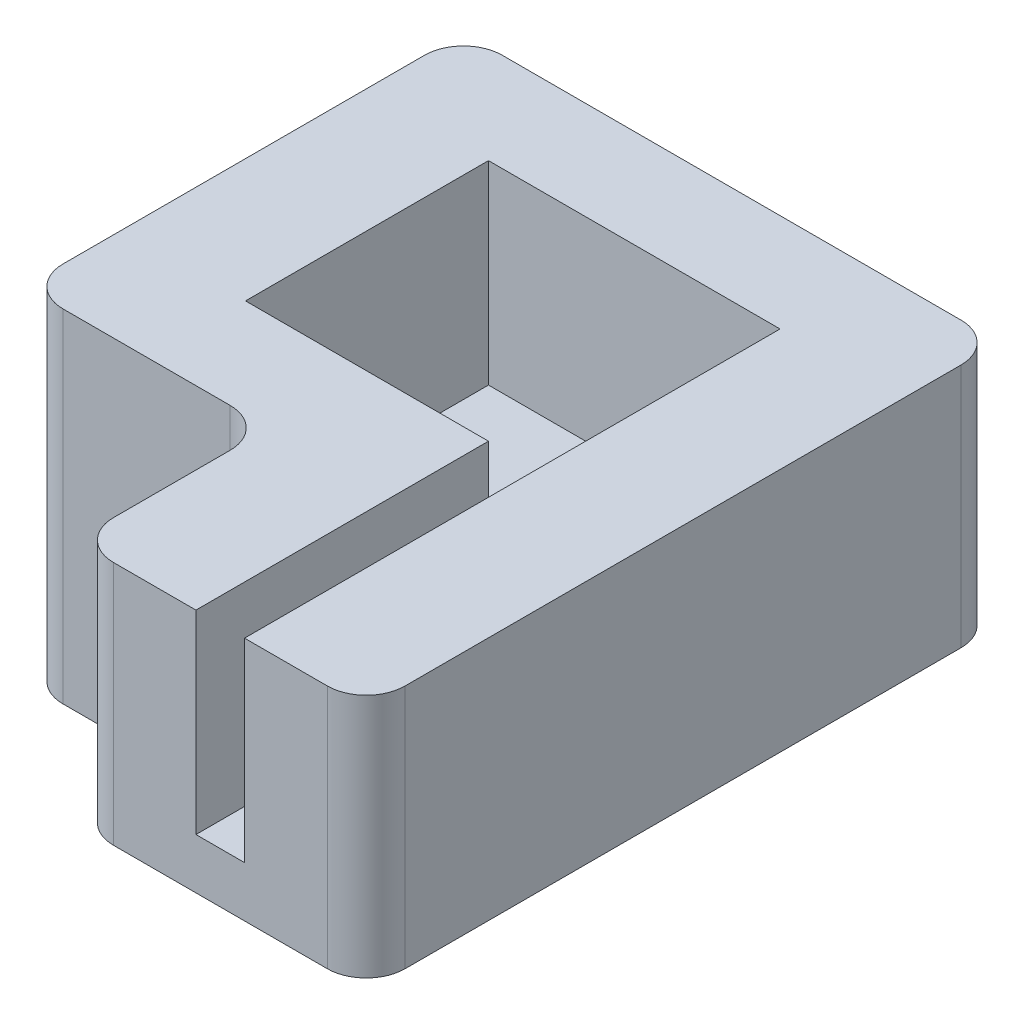
ISO-10303-21;
HEADER;
FILE_DESCRIPTION(('STEP AP214'),'2;1');
FILE_NAME('part.step','',(''),(''),'','','');
FILE_SCHEMA(('AUTOMOTIVE_DESIGN { 1 0 10303 214 1 1 1 1 }'));
ENDSEC;
DATA;
#1=APPLICATION_CONTEXT('core data for automotive mechanical design processes');
#2=APPLICATION_PROTOCOL_DEFINITION('international standard','automotive_design',2000,#1);
#3=PRODUCT_CONTEXT('',#1,'mechanical');
#4=PRODUCT('Part','Part','',(#3));
#5=PRODUCT_RELATED_PRODUCT_CATEGORY('part','',(#4));
#6=PRODUCT_DEFINITION_FORMATION('','',#4);
#7=PRODUCT_DEFINITION_CONTEXT('part definition',#1,'design');
#8=PRODUCT_DEFINITION('design','',#6,#7);
#9=PRODUCT_DEFINITION_SHAPE('','',#8);
#10=(LENGTH_UNIT() NAMED_UNIT(*) SI_UNIT(.MILLI.,.METRE.));
#11=(NAMED_UNIT(*) PLANE_ANGLE_UNIT() SI_UNIT($,.RADIAN.));
#12=(NAMED_UNIT(*) SI_UNIT($,.STERADIAN.) SOLID_ANGLE_UNIT());
#13=UNCERTAINTY_MEASURE_WITH_UNIT(LENGTH_MEASURE(1.E-05),#10,'distance_accuracy_value','');
#14=(GEOMETRIC_REPRESENTATION_CONTEXT(3) GLOBAL_UNCERTAINTY_ASSIGNED_CONTEXT((#13)) GLOBAL_UNIT_ASSIGNED_CONTEXT((#10,
#11,#12)) REPRESENTATION_CONTEXT('',''));
#15=CARTESIAN_POINT('',(0.,0.,0.));
#16=DIRECTION('',(0.,0.,1.));
#17=DIRECTION('',(1.,0.,0.));
#18=AXIS2_PLACEMENT_3D('',#15,#16,#17);
#19=CARTESIAN_POINT('',(-17.526,22.352,14.351));
#20=DIRECTION('',(0.,0.,-1.));
#21=DIRECTION('',(-1.,0.,0.));
#22=AXIS2_PLACEMENT_3D('',#19,#20,#21);
#23=PLANE('',#22);
#24=DIRECTION('',(1.,0.,0.));
#25=VECTOR('',#24,1.);
#26=CARTESIAN_POINT('',(-17.526,0.,14.351));
#27=LINE('',#26,#25);
#28=CARTESIAN_POINT('',(-14.986,0.,14.351));
#29=VERTEX_POINT('',#28);
#30=CARTESIAN_POINT('',(8.636,0.,14.351));
#31=VERTEX_POINT('',#30);
#32=EDGE_CURVE('E267',#29,#31,#27,.T.);
#33=ORIENTED_EDGE('',*,*,#32,.T.);
#34=DIRECTION('',(0.,-1.,0.));
#35=VECTOR('',#34,1.);
#36=CARTESIAN_POINT('',(8.636,22.352,14.351));
#37=LINE('',#36,#35);
#38=CARTESIAN_POINT('',(8.63600000000001,6.35,14.351));
#39=VERTEX_POINT('',#38);
#40=EDGE_CURVE('E351',#31,#39,#37,.F.);
#41=ORIENTED_EDGE('',*,*,#40,.T.);
#42=DIRECTION('',(1.,0.,0.));
#43=VECTOR('',#42,1.);
#44=CARTESIAN_POINT('',(17.526,6.35,14.351));
#45=LINE('',#44,#43);
#46=CARTESIAN_POINT('',(-4.06399999999999,6.35,14.351));
#47=VERTEX_POINT('',#46);
#48=EDGE_CURVE('E230',#47,#39,#45,.T.);
#49=ORIENTED_EDGE('',*,*,#48,.F.);
#50=DIRECTION('',(0.,-1.,0.));
#51=VECTOR('',#50,1.);
#52=CARTESIAN_POINT('',(-4.064,22.352,14.351));
#53=LINE('',#52,#51);
#54=CARTESIAN_POINT('',(-4.064,22.352,14.351));
#55=VERTEX_POINT('',#54);
#56=EDGE_CURVE('E315',#47,#55,#53,.F.);
#57=ORIENTED_EDGE('',*,*,#56,.T.);
#58=DIRECTION('',(1.,0.,0.));
#59=VECTOR('',#58,1.);
#60=CARTESIAN_POINT('',(-17.526,22.352,14.351));
#61=LINE('',#60,#59);
#62=CARTESIAN_POINT('',(-14.986,22.352,14.351));
#63=VERTEX_POINT('',#62);
#64=EDGE_CURVE('E273',#63,#55,#61,.T.);
#65=ORIENTED_EDGE('',*,*,#64,.F.);
#66=DIRECTION('',(0.,-1.,0.));
#67=VECTOR('',#66,1.);
#68=CARTESIAN_POINT('',(-14.986,22.352,14.351));
#69=LINE('',#68,#67);
#70=EDGE_CURVE('E317',#63,#29,#69,.T.);
#71=ORIENTED_EDGE('',*,*,#70,.T.);
#72=EDGE_LOOP('',(#33,#41,#49,#57,#65,#71));
#73=FACE_BOUND('',#72,.T.);
#74=ADVANCED_FACE('F36',(#73),#23,.F.);
#75=CARTESIAN_POINT('',(17.526,22.352,-14.351));
#76=DIRECTION('',(-1.,0.,0.));
#77=DIRECTION('',(0.,0.,1.));
#78=AXIS2_PLACEMENT_3D('',#75,#76,#77);
#79=PLANE('',#78);
#80=DIRECTION('',(0.,0.,-1.));
#81=VECTOR('',#80,1.);
#82=CARTESIAN_POINT('',(17.526,22.352,-14.351));
#83=LINE('',#82,#81);
#84=CARTESIAN_POINT('',(17.526,22.352,24.511));
#85=VERTEX_POINT('',#84);
#86=CARTESIAN_POINT('',(17.526,22.352,-11.811));
#87=VERTEX_POINT('',#86);
#88=EDGE_CURVE('E264',#85,#87,#83,.T.);
#89=ORIENTED_EDGE('',*,*,#88,.F.);
#90=DIRECTION('',(0.,1.,0.));
#91=VECTOR('',#90,1.);
#92=CARTESIAN_POINT('',(17.526,6.35,24.511));
#93=LINE('',#92,#91);
#94=CARTESIAN_POINT('',(17.526,6.35,24.511));
#95=VERTEX_POINT('',#94);
#96=EDGE_CURVE('E44',#85,#95,#93,.F.);
#97=ORIENTED_EDGE('',*,*,#96,.T.);
#98=DIRECTION('',(0.,0.,1.));
#99=VECTOR('',#98,1.);
#100=CARTESIAN_POINT('',(17.526,6.35000000000001,-14.351));
#101=LINE('',#100,#99);
#102=CARTESIAN_POINT('',(17.526,6.35000000000001,-11.811));
#103=VERTEX_POINT('',#102);
#104=EDGE_CURVE('E252',#103,#95,#101,.T.);
#105=ORIENTED_EDGE('',*,*,#104,.F.);
#106=DIRECTION('',(0.,-1.,0.));
#107=VECTOR('',#106,1.);
#108=CARTESIAN_POINT('',(17.526,22.352,-11.811));
#109=LINE('',#108,#107);
#110=EDGE_CURVE('E291',#103,#87,#109,.F.);
#111=ORIENTED_EDGE('',*,*,#110,.T.);
#112=EDGE_LOOP('',(#89,#97,#105,#111));
#113=FACE_BOUND('',#112,.T.);
#114=ADVANCED_FACE('F356',(#113),#79,.F.);
#115=CARTESIAN_POINT('',(-17.526,22.352,-14.351));
#116=DIRECTION('',(0.,0.,1.));
#117=DIRECTION('',(1.,0.,0.));
#118=AXIS2_PLACEMENT_3D('',#115,#116,#117);
#119=PLANE('',#118);
#120=DIRECTION('',(-1.,0.,0.));
#121=VECTOR('',#120,1.);
#122=CARTESIAN_POINT('',(-17.526,22.352,-14.351));
#123=LINE('',#122,#121);
#124=CARTESIAN_POINT('',(14.986,22.352,-14.351));
#125=VERTEX_POINT('',#124);
#126=CARTESIAN_POINT('',(-14.986,22.352,-14.351));
#127=VERTEX_POINT('',#126);
#128=EDGE_CURVE('E266',#125,#127,#123,.T.);
#129=ORIENTED_EDGE('',*,*,#128,.F.);
#130=DIRECTION('',(0.,-1.,0.));
#131=VECTOR('',#130,1.);
#132=CARTESIAN_POINT('',(14.986,22.352,-14.351));
#133=LINE('',#132,#131);
#134=CARTESIAN_POINT('',(14.986,6.35000000000001,-14.351));
#135=VERTEX_POINT('',#134);
#136=EDGE_CURVE('E286',#125,#135,#133,.T.);
#137=ORIENTED_EDGE('',*,*,#136,.T.);
#138=DIRECTION('',(1.,0.,0.));
#139=VECTOR('',#138,1.);
#140=CARTESIAN_POINT('',(11.176,6.35000000000001,-14.351));
#141=LINE('',#140,#139);
#142=CARTESIAN_POINT('',(8.636,6.35000000000001,-14.351));
#143=VERTEX_POINT('',#142);
#144=EDGE_CURVE('E258',#143,#135,#141,.T.);
#145=ORIENTED_EDGE('',*,*,#144,.F.);
#146=DIRECTION('',(0.,1.,0.));
#147=VECTOR('',#146,1.);
#148=CARTESIAN_POINT('',(8.636,22.352,-14.351));
#149=LINE('',#148,#147);
#150=CARTESIAN_POINT('',(8.636,0.,-14.351));
#151=VERTEX_POINT('',#150);
#152=EDGE_CURVE('E284',#143,#151,#149,.F.);
#153=ORIENTED_EDGE('',*,*,#152,.T.);
#154=DIRECTION('',(-1.,0.,0.));
#155=VECTOR('',#154,1.);
#156=CARTESIAN_POINT('',(-17.526,0.,-14.351));
#157=LINE('',#156,#155);
#158=CARTESIAN_POINT('',(-14.986,0.,-14.351));
#159=VERTEX_POINT('',#158);
#160=EDGE_CURVE('E263',#151,#159,#157,.T.);
#161=ORIENTED_EDGE('',*,*,#160,.T.);
#162=DIRECTION('',(0.,-1.,0.));
#163=VECTOR('',#162,1.);
#164=CARTESIAN_POINT('',(-14.986,22.352,-14.351));
#165=LINE('',#164,#163);
#166=EDGE_CURVE('E276',#159,#127,#165,.F.);
#167=ORIENTED_EDGE('',*,*,#166,.T.);
#168=EDGE_LOOP('',(#129,#137,#145,#153,#161,#167));
#169=FACE_BOUND('',#168,.T.);
#170=ADVANCED_FACE('F412',(#169),#119,.F.);
#171=CARTESIAN_POINT('',(-17.526,22.352,-14.351));
#172=DIRECTION('',(1.,0.,0.));
#173=DIRECTION('',(0.,0.,-1.));
#174=AXIS2_PLACEMENT_3D('',#171,#172,#173);
#175=PLANE('',#174);
#176=DIRECTION('',(0.,0.,1.));
#177=VECTOR('',#176,1.);
#178=CARTESIAN_POINT('',(-17.526,22.352,-14.351));
#179=LINE('',#178,#177);
#180=CARTESIAN_POINT('',(-17.526,22.352,-11.811));
#181=VERTEX_POINT('',#180);
#182=CARTESIAN_POINT('',(-17.526,22.352,11.811));
#183=VERTEX_POINT('',#182);
#184=EDGE_CURVE('E270',#181,#183,#179,.T.);
#185=ORIENTED_EDGE('',*,*,#184,.F.);
#186=DIRECTION('',(0.,-1.,0.));
#187=VECTOR('',#186,1.);
#188=CARTESIAN_POINT('',(-17.526,22.352,-11.811));
#189=LINE('',#188,#187);
#190=CARTESIAN_POINT('',(-17.526,0.,-11.811));
#191=VERTEX_POINT('',#190);
#192=EDGE_CURVE('E312',#181,#191,#189,.T.);
#193=ORIENTED_EDGE('',*,*,#192,.T.);
#194=DIRECTION('',(0.,0.,1.));
#195=VECTOR('',#194,1.);
#196=CARTESIAN_POINT('',(-17.526,0.,-14.351));
#197=LINE('',#196,#195);
#198=CARTESIAN_POINT('',(-17.526,0.,11.811));
#199=VERTEX_POINT('',#198);
#200=EDGE_CURVE('E279',#191,#199,#197,.T.);
#201=ORIENTED_EDGE('',*,*,#200,.T.);
#202=DIRECTION('',(0.,-1.,0.));
#203=VECTOR('',#202,1.);
#204=CARTESIAN_POINT('',(-17.526,22.352,11.811));
#205=LINE('',#204,#203);
#206=EDGE_CURVE('E310',#199,#183,#205,.F.);
#207=ORIENTED_EDGE('',*,*,#206,.T.);
#208=EDGE_LOOP('',(#185,#193,#201,#207));
#209=FACE_BOUND('',#208,.T.);
#210=ADVANCED_FACE('F425',(#209),#175,.F.);
#211=CARTESIAN_POINT('',(0.,22.352,0.));
#212=DIRECTION('',(0.,1.,0.));
#213=DIRECTION('',(0.,0.,1.));
#214=AXIS2_PLACEMENT_3D('',#211,#212,#213);
#215=PLANE('',#214);
#216=DIRECTION('',(0.,0.,-1.));
#217=VECTOR('',#216,1.);
#218=CARTESIAN_POINT('',(-1.524,22.352,27.051));
#219=LINE('',#218,#217);
#220=CARTESIAN_POINT('',(-1.524,22.352,24.511));
#221=VERTEX_POINT('',#220);
#222=CARTESIAN_POINT('',(-1.524,22.352,16.891));
#223=VERTEX_POINT('',#222);
#224=EDGE_CURVE('E250',#221,#223,#219,.T.);
#225=ORIENTED_EDGE('',*,*,#224,.F.);
#226=CARTESIAN_POINT('',(1.016,22.352,24.511));
#227=DIRECTION('',(0.,1.,0.));
#228=DIRECTION('',(0.,0.,1.));
#229=AXIS2_PLACEMENT_3D('',#226,#227,#228);
#230=CIRCLE('',#229,2.54);
#231=CARTESIAN_POINT('',(1.016,22.352,27.051));
#232=VERTEX_POINT('',#231);
#233=EDGE_CURVE('E346',#221,#232,#230,.T.);
#234=ORIENTED_EDGE('',*,*,#233,.T.);
#235=DIRECTION('',(-1.,0.,0.));
#236=VECTOR('',#235,1.);
#237=CARTESIAN_POINT('',(17.526,22.352,27.051));
#238=LINE('',#237,#236);
#239=CARTESIAN_POINT('',(6.40080000000001,22.352,27.051));
#240=VERTEX_POINT('',#239);
#241=EDGE_CURVE('E243',#240,#232,#238,.T.);
#242=ORIENTED_EDGE('',*,*,#241,.F.);
#243=DIRECTION('',(0.,0.,1.));
#244=VECTOR('',#243,1.);
#245=CARTESIAN_POINT('',(6.40080000000001,22.352,7.9375));
#246=LINE('',#245,#244);
#247=CARTESIAN_POINT('',(6.40080000000001,22.352,7.9375));
#248=VERTEX_POINT('',#247);
#249=EDGE_CURVE('E212',#248,#240,#246,.T.);
#250=ORIENTED_EDGE('',*,*,#249,.F.);
#251=DIRECTION('',(1.,0.,0.));
#252=VECTOR('',#251,1.);
#253=CARTESIAN_POINT('',(-9.47419999999999,22.352,7.9375));
#254=LINE('',#253,#252);
#255=CARTESIAN_POINT('',(-9.47419999999999,22.352,7.9375));
#256=VERTEX_POINT('',#255);
#257=EDGE_CURVE('E224',#256,#248,#254,.T.);
#258=ORIENTED_EDGE('',*,*,#257,.F.);
#259=DIRECTION('',(0.,0.,1.));
#260=VECTOR('',#259,1.);
#261=CARTESIAN_POINT('',(-9.47419999999999,22.352,-7.93750000000001));
#262=LINE('',#261,#260);
#263=CARTESIAN_POINT('',(-9.47419999999999,22.352,-7.93750000000001));
#264=VERTEX_POINT('',#263);
#265=EDGE_CURVE('E222',#264,#256,#262,.T.);
#266=ORIENTED_EDGE('',*,*,#265,.F.);
#267=DIRECTION('',(-1.,0.,0.));
#268=VECTOR('',#267,1.);
#269=CARTESIAN_POINT('',(9.57580000000001,22.352,-7.93750000000001));
#270=LINE('',#269,#268);
#271=CARTESIAN_POINT('',(9.57580000000001,22.352,-7.93750000000001));
#272=VERTEX_POINT('',#271);
#273=EDGE_CURVE('E192',#272,#264,#270,.T.);
#274=ORIENTED_EDGE('',*,*,#273,.F.);
#275=DIRECTION('',(0.,0.,-1.));
#276=VECTOR('',#275,1.);
#277=CARTESIAN_POINT('',(9.57580000000001,22.352,27.051));
#278=LINE('',#277,#276);
#279=CARTESIAN_POINT('',(9.57580000000001,22.352,27.051));
#280=VERTEX_POINT('',#279);
#281=EDGE_CURVE('E209',#280,#272,#278,.T.);
#282=ORIENTED_EDGE('',*,*,#281,.F.);
#283=CARTESIAN_POINT('',(14.986,22.352,27.051));
#284=VERTEX_POINT('',#283);
#285=EDGE_CURVE('E240',#284,#280,#238,.T.);
#286=ORIENTED_EDGE('',*,*,#285,.F.);
#287=CARTESIAN_POINT('',(14.986,22.352,24.511));
#288=DIRECTION('',(0.,1.,0.));
#289=DIRECTION('',(0.,0.,1.));
#290=AXIS2_PLACEMENT_3D('',#287,#288,#289);
#291=CIRCLE('',#290,2.54);
#292=EDGE_CURVE('E344',#284,#85,#291,.T.);
#293=ORIENTED_EDGE('',*,*,#292,.T.);
#294=ORIENTED_EDGE('',*,*,#88,.T.);
#295=CARTESIAN_POINT('',(14.986,22.352,-11.811));
#296=DIRECTION('',(0.,1.,0.));
#297=DIRECTION('',(0.,0.,1.));
#298=AXIS2_PLACEMENT_3D('',#295,#296,#297);
#299=CIRCLE('',#298,2.54);
#300=EDGE_CURVE('E298',#87,#125,#299,.T.);
#301=ORIENTED_EDGE('',*,*,#300,.T.);
#302=ORIENTED_EDGE('',*,*,#128,.T.);
#303=CARTESIAN_POINT('',(-14.986,22.352,-11.811));
#304=DIRECTION('',(0.,1.,0.));
#305=DIRECTION('',(0.,0.,1.));
#306=AXIS2_PLACEMENT_3D('',#303,#304,#305);
#307=CIRCLE('',#306,2.54);
#308=EDGE_CURVE('E296',#127,#181,#307,.T.);
#309=ORIENTED_EDGE('',*,*,#308,.T.);
#310=ORIENTED_EDGE('',*,*,#184,.T.);
#311=CARTESIAN_POINT('',(-14.986,22.352,11.811));
#312=DIRECTION('',(0.,1.,0.));
#313=DIRECTION('',(0.,0.,1.));
#314=AXIS2_PLACEMENT_3D('',#311,#312,#313);
#315=CIRCLE('',#314,2.54);
#316=EDGE_CURVE('E294',#183,#63,#315,.T.);
#317=ORIENTED_EDGE('',*,*,#316,.T.);
#318=ORIENTED_EDGE('',*,*,#64,.T.);
#319=CARTESIAN_POINT('',(-4.064,22.352,16.891));
#320=DIRECTION('',(0.,1.,0.));
#321=DIRECTION('',(0.,0.,1.));
#322=AXIS2_PLACEMENT_3D('',#319,#320,#321);
#323=CIRCLE('',#322,2.54);
#324=EDGE_CURVE('E329',#55,#223,#323,.F.);
#325=ORIENTED_EDGE('',*,*,#324,.T.);
#326=EDGE_LOOP('',(#225,#234,#242,#250,#258,#266,#274,#282,#286,#293,#294,#301,#302,#309,#310,
#317,#318,#325));
#327=FACE_BOUND('',#326,.T.);
#328=ADVANCED_FACE('F372',(#327),#215,.T.);
#329=CARTESIAN_POINT('',(0.,0.,0.));
#330=DIRECTION('',(0.,1.,0.));
#331=DIRECTION('',(0.,0.,1.));
#332=AXIS2_PLACEMENT_3D('',#329,#330,#331);
#333=PLANE('',#332);
#334=DIRECTION('',(0.,0.,-1.));
#335=VECTOR('',#334,1.);
#336=CARTESIAN_POINT('',(11.176,0.,-14.351));
#337=LINE('',#336,#335);
#338=CARTESIAN_POINT('',(11.176,0.,11.811));
#339=VERTEX_POINT('',#338);
#340=CARTESIAN_POINT('',(11.176,0.,-11.811));
#341=VERTEX_POINT('',#340);
#342=EDGE_CURVE('E253',#339,#341,#337,.T.);
#343=ORIENTED_EDGE('',*,*,#342,.F.);
#344=CARTESIAN_POINT('',(8.63600000000001,0.,11.811));
#345=DIRECTION('',(0.,1.,0.));
#346=DIRECTION('',(0.,0.,1.));
#347=AXIS2_PLACEMENT_3D('',#344,#345,#346);
#348=CIRCLE('',#347,2.54);
#349=EDGE_CURVE('E51',#339,#31,#348,.F.);
#350=ORIENTED_EDGE('',*,*,#349,.T.);
#351=ORIENTED_EDGE('',*,*,#32,.F.);
#352=CARTESIAN_POINT('',(-14.986,0.,11.811));
#353=DIRECTION('',(0.,1.,0.));
#354=DIRECTION('',(0.,0.,1.));
#355=AXIS2_PLACEMENT_3D('',#352,#353,#354);
#356=CIRCLE('',#355,2.54);
#357=EDGE_CURVE('E303',#29,#199,#356,.F.);
#358=ORIENTED_EDGE('',*,*,#357,.T.);
#359=ORIENTED_EDGE('',*,*,#200,.F.);
#360=CARTESIAN_POINT('',(-14.986,0.,-11.811));
#361=DIRECTION('',(0.,1.,0.));
#362=DIRECTION('',(0.,0.,1.));
#363=AXIS2_PLACEMENT_3D('',#360,#361,#362);
#364=CIRCLE('',#363,2.54);
#365=EDGE_CURVE('E305',#191,#159,#364,.F.);
#366=ORIENTED_EDGE('',*,*,#365,.T.);
#367=ORIENTED_EDGE('',*,*,#160,.F.);
#368=CARTESIAN_POINT('',(8.636,0.,-11.811));
#369=DIRECTION('',(0.,1.,0.));
#370=DIRECTION('',(0.,0.,1.));
#371=AXIS2_PLACEMENT_3D('',#368,#369,#370);
#372=CIRCLE('',#371,2.54);
#373=EDGE_CURVE('E307',#151,#341,#372,.F.);
#374=ORIENTED_EDGE('',*,*,#373,.T.);
#375=EDGE_LOOP('',(#343,#350,#351,#358,#359,#366,#367,#374));
#376=FACE_BOUND('',#375,.T.);
#377=ADVANCED_FACE('F403',(#376),#333,.F.);
#378=CARTESIAN_POINT('',(11.176,6.35000000000001,-14.351));
#379=DIRECTION('',(0.,1.,0.));
#380=DIRECTION('',(0.,0.,1.));
#381=AXIS2_PLACEMENT_3D('',#378,#379,#380);
#382=PLANE('',#381);
#383=DIRECTION('',(1.,0.,0.));
#384=VECTOR('',#383,1.);
#385=CARTESIAN_POINT('',(17.526,6.35,27.051));
#386=LINE('',#385,#384);
#387=CARTESIAN_POINT('',(1.01600000000001,6.35,27.051));
#388=VERTEX_POINT('',#387);
#389=CARTESIAN_POINT('',(14.986,6.35,27.051));
#390=VERTEX_POINT('',#389);
#391=EDGE_CURVE('E242',#388,#390,#386,.T.);
#392=ORIENTED_EDGE('',*,*,#391,.F.);
#393=CARTESIAN_POINT('',(1.01600000000001,6.35,24.511));
#394=DIRECTION('',(0.,1.,0.));
#395=DIRECTION('',(0.,0.,1.));
#396=AXIS2_PLACEMENT_3D('',#393,#394,#395);
#397=CIRCLE('',#396,2.54);
#398=CARTESIAN_POINT('',(-1.52399999999999,6.35,24.511));
#399=VERTEX_POINT('',#398);
#400=EDGE_CURVE('E340',#388,#399,#397,.F.);
#401=ORIENTED_EDGE('',*,*,#400,.T.);
#402=DIRECTION('',(0.,0.,-1.));
#403=VECTOR('',#402,1.);
#404=CARTESIAN_POINT('',(-1.52399999999999,6.35,27.051));
#405=LINE('',#404,#403);
#406=CARTESIAN_POINT('',(-1.52399999999999,6.35,16.891));
#407=VERTEX_POINT('',#406);
#408=EDGE_CURVE('E246',#399,#407,#405,.T.);
#409=ORIENTED_EDGE('',*,*,#408,.T.);
#410=CARTESIAN_POINT('',(-4.06399999999999,6.35,16.891));
#411=DIRECTION('',(0.,1.,0.));
#412=DIRECTION('',(0.,0.,1.));
#413=AXIS2_PLACEMENT_3D('',#410,#411,#412);
#414=CIRCLE('',#413,2.54);
#415=EDGE_CURVE('E326',#407,#47,#414,.T.);
#416=ORIENTED_EDGE('',*,*,#415,.T.);
#417=ORIENTED_EDGE('',*,*,#48,.T.);
#418=CARTESIAN_POINT('',(8.63600000000001,6.35,11.811));
#419=DIRECTION('',(0.,1.,0.));
#420=DIRECTION('',(0.,0.,1.));
#421=AXIS2_PLACEMENT_3D('',#418,#419,#420);
#422=CIRCLE('',#421,2.54);
#423=CARTESIAN_POINT('',(11.176,6.35,11.811));
#424=VERTEX_POINT('',#423);
#425=EDGE_CURVE('E11',#39,#424,#422,.T.);
#426=ORIENTED_EDGE('',*,*,#425,.T.);
#427=DIRECTION('',(0.,0.,1.));
#428=VECTOR('',#427,1.);
#429=CARTESIAN_POINT('',(11.176,6.35000000000001,-14.351));
#430=LINE('',#429,#428);
#431=CARTESIAN_POINT('',(11.176,6.35000000000001,-11.811));
#432=VERTEX_POINT('',#431);
#433=EDGE_CURVE('E255',#432,#424,#430,.T.);
#434=ORIENTED_EDGE('',*,*,#433,.F.);
#435=CARTESIAN_POINT('',(8.636,6.35000000000001,-11.811));
#436=DIRECTION('',(0.,1.,0.));
#437=DIRECTION('',(0.,0.,1.));
#438=AXIS2_PLACEMENT_3D('',#435,#436,#437);
#439=CIRCLE('',#438,2.54);
#440=EDGE_CURVE('E323',#432,#143,#439,.T.);
#441=ORIENTED_EDGE('',*,*,#440,.T.);
#442=ORIENTED_EDGE('',*,*,#144,.T.);
#443=CARTESIAN_POINT('',(14.986,6.35000000000001,-11.811));
#444=DIRECTION('',(0.,1.,0.));
#445=DIRECTION('',(0.,0.,1.));
#446=AXIS2_PLACEMENT_3D('',#443,#444,#445);
#447=CIRCLE('',#446,2.54);
#448=EDGE_CURVE('E289',#135,#103,#447,.F.);
#449=ORIENTED_EDGE('',*,*,#448,.T.);
#450=ORIENTED_EDGE('',*,*,#104,.T.);
#451=CARTESIAN_POINT('',(14.986,6.35,24.511));
#452=DIRECTION('',(0.,1.,0.));
#453=DIRECTION('',(0.,0.,1.));
#454=AXIS2_PLACEMENT_3D('',#451,#452,#453);
#455=CIRCLE('',#454,2.54);
#456=EDGE_CURVE('E338',#95,#390,#455,.F.);
#457=ORIENTED_EDGE('',*,*,#456,.T.);
#458=EDGE_LOOP('',(#392,#401,#409,#416,#417,#426,#434,#441,#442,#449,#450,#457));
#459=FACE_BOUND('',#458,.T.);
#460=ADVANCED_FACE('F362',(#459),#382,.F.);
#461=CARTESIAN_POINT('',(11.176,0.,0.));
#462=DIRECTION('',(-1.,0.,0.));
#463=DIRECTION('',(0.,0.,1.));
#464=AXIS2_PLACEMENT_3D('',#461,#462,#463);
#465=PLANE('',#464);
#466=ORIENTED_EDGE('',*,*,#433,.T.);
#467=DIRECTION('',(0.,-1.,0.));
#468=VECTOR('',#467,1.);
#469=CARTESIAN_POINT('',(11.176,0.,11.811));
#470=LINE('',#469,#468);
#471=EDGE_CURVE('E348',#424,#339,#470,.T.);
#472=ORIENTED_EDGE('',*,*,#471,.T.);
#473=ORIENTED_EDGE('',*,*,#342,.T.);
#474=DIRECTION('',(0.,1.,0.));
#475=VECTOR('',#474,1.);
#476=CARTESIAN_POINT('',(11.176,0.,-11.811));
#477=LINE('',#476,#475);
#478=EDGE_CURVE('E300',#341,#432,#477,.T.);
#479=ORIENTED_EDGE('',*,*,#478,.T.);
#480=EDGE_LOOP('',(#466,#472,#473,#479));
#481=FACE_BOUND('',#480,.T.);
#482=ADVANCED_FACE('F402',(#481),#465,.F.);
#483=CARTESIAN_POINT('',(-1.524,22.352,27.051));
#484=DIRECTION('',(1.,0.,0.));
#485=DIRECTION('',(0.,1.,0.));
#486=AXIS2_PLACEMENT_3D('',#483,#484,#485);
#487=PLANE('',#486);
#488=ORIENTED_EDGE('',*,*,#408,.F.);
#489=DIRECTION('',(0.,-1.,0.));
#490=VECTOR('',#489,1.);
#491=CARTESIAN_POINT('',(-1.524,22.352,24.511));
#492=LINE('',#491,#490);
#493=EDGE_CURVE('E342',#399,#221,#492,.F.);
#494=ORIENTED_EDGE('',*,*,#493,.T.);
#495=ORIENTED_EDGE('',*,*,#224,.T.);
#496=DIRECTION('',(0.,-1.,0.));
#497=VECTOR('',#496,1.);
#498=CARTESIAN_POINT('',(-1.52399999999999,6.35,16.891));
#499=LINE('',#498,#497);
#500=EDGE_CURVE('E320',#223,#407,#499,.T.);
#501=ORIENTED_EDGE('',*,*,#500,.T.);
#502=EDGE_LOOP('',(#488,#494,#495,#501));
#503=FACE_BOUND('',#502,.T.);
#504=ADVANCED_FACE('F391',(#503),#487,.F.);
#505=CARTESIAN_POINT('',(0.,0.,27.051));
#506=DIRECTION('',(0.,0.,1.));
#507=DIRECTION('',(1.,0.,0.));
#508=AXIS2_PLACEMENT_3D('',#505,#506,#507);
#509=PLANE('',#508);
#510=ORIENTED_EDGE('',*,*,#241,.T.);
#511=DIRECTION('',(0.,-1.,0.));
#512=VECTOR('',#511,1.);
#513=CARTESIAN_POINT('',(1.01600000000001,6.35,27.051));
#514=LINE('',#513,#512);
#515=EDGE_CURVE('E335',#232,#388,#514,.T.);
#516=ORIENTED_EDGE('',*,*,#515,.T.);
#517=ORIENTED_EDGE('',*,*,#391,.T.);
#518=DIRECTION('',(0.,1.,0.));
#519=VECTOR('',#518,1.);
#520=CARTESIAN_POINT('',(14.986,22.352,27.051));
#521=LINE('',#520,#519);
#522=EDGE_CURVE('E332',#390,#284,#521,.T.);
#523=ORIENTED_EDGE('',*,*,#522,.T.);
#524=ORIENTED_EDGE('',*,*,#285,.T.);
#525=DIRECTION('',(0.,1.,0.));
#526=VECTOR('',#525,1.);
#527=CARTESIAN_POINT('',(9.57580000000001,9.652,27.051));
#528=LINE('',#527,#526);
#529=CARTESIAN_POINT('',(9.57580000000001,9.652,27.051));
#530=VERTEX_POINT('',#529);
#531=EDGE_CURVE('E231',#530,#280,#528,.T.);
#532=ORIENTED_EDGE('',*,*,#531,.F.);
#533=DIRECTION('',(1.,0.,0.));
#534=VECTOR('',#533,1.);
#535=CARTESIAN_POINT('',(6.40080000000001,9.652,27.051));
#536=LINE('',#535,#534);
#537=CARTESIAN_POINT('',(6.40080000000001,9.652,27.051));
#538=VERTEX_POINT('',#537);
#539=EDGE_CURVE('E218',#538,#530,#536,.T.);
#540=ORIENTED_EDGE('',*,*,#539,.F.);
#541=DIRECTION('',(0.,1.,0.));
#542=VECTOR('',#541,1.);
#543=CARTESIAN_POINT('',(6.40080000000001,9.652,27.051));
#544=LINE('',#543,#542);
#545=EDGE_CURVE('E234',#538,#240,#544,.T.);
#546=ORIENTED_EDGE('',*,*,#545,.T.);
#547=EDGE_LOOP('',(#510,#516,#517,#523,#524,#532,#540,#546));
#548=FACE_BOUND('',#547,.T.);
#549=ADVANCED_FACE('F367',(#548),#509,.T.);
#550=CARTESIAN_POINT('',(9.57580000000001,9.652,-7.93750000000001));
#551=DIRECTION('',(0.,0.,-1.));
#552=DIRECTION('',(-1.,0.,0.));
#553=AXIS2_PLACEMENT_3D('',#550,#551,#552);
#554=PLANE('',#553);
#555=ORIENTED_EDGE('',*,*,#273,.T.);
#556=DIRECTION('',(0.,1.,0.));
#557=VECTOR('',#556,1.);
#558=CARTESIAN_POINT('',(-9.47419999999999,9.652,-7.93750000000001));
#559=LINE('',#558,#557);
#560=CARTESIAN_POINT('',(-9.47419999999999,9.652,-7.93750000000001));
#561=VERTEX_POINT('',#560);
#562=EDGE_CURVE('E185',#561,#264,#559,.T.);
#563=ORIENTED_EDGE('',*,*,#562,.F.);
#564=DIRECTION('',(-1.,0.,0.));
#565=VECTOR('',#564,1.);
#566=CARTESIAN_POINT('',(9.57580000000001,9.652,-7.93750000000001));
#567=LINE('',#566,#565);
#568=CARTESIAN_POINT('',(9.57580000000001,9.652,-7.93750000000001));
#569=VERTEX_POINT('',#568);
#570=EDGE_CURVE('E189',#569,#561,#567,.T.);
#571=ORIENTED_EDGE('',*,*,#570,.F.);
#572=DIRECTION('',(0.,1.,0.));
#573=VECTOR('',#572,1.);
#574=CARTESIAN_POINT('',(9.57580000000001,9.652,-7.93750000000001));
#575=LINE('',#574,#573);
#576=EDGE_CURVE('E228',#569,#272,#575,.T.);
#577=ORIENTED_EDGE('',*,*,#576,.T.);
#578=EDGE_LOOP('',(#555,#563,#571,#577));
#579=FACE_BOUND('',#578,.T.);
#580=ADVANCED_FACE('F187',(#579),#554,.F.);
#581=CARTESIAN_POINT('',(9.57580000000001,9.652,27.051));
#582=DIRECTION('',(1.,0.,0.));
#583=DIRECTION('',(0.,0.,-1.));
#584=AXIS2_PLACEMENT_3D('',#581,#582,#583);
#585=PLANE('',#584);
#586=ORIENTED_EDGE('',*,*,#281,.T.);
#587=ORIENTED_EDGE('',*,*,#576,.F.);
#588=DIRECTION('',(0.,0.,-1.));
#589=VECTOR('',#588,1.);
#590=CARTESIAN_POINT('',(9.57580000000001,9.652,27.051));
#591=LINE('',#590,#589);
#592=EDGE_CURVE('E197',#530,#569,#591,.T.);
#593=ORIENTED_EDGE('',*,*,#592,.F.);
#594=ORIENTED_EDGE('',*,*,#531,.T.);
#595=EDGE_LOOP('',(#586,#587,#593,#594));
#596=FACE_BOUND('',#595,.T.);
#597=ADVANCED_FACE('F374',(#596),#585,.F.);
#598=CARTESIAN_POINT('',(6.40080000000001,9.652,7.9375));
#599=DIRECTION('',(-1.,0.,0.));
#600=DIRECTION('',(0.,0.,1.));
#601=AXIS2_PLACEMENT_3D('',#598,#599,#600);
#602=PLANE('',#601);
#603=ORIENTED_EDGE('',*,*,#249,.T.);
#604=ORIENTED_EDGE('',*,*,#545,.F.);
#605=DIRECTION('',(0.,0.,1.));
#606=VECTOR('',#605,1.);
#607=CARTESIAN_POINT('',(6.40080000000001,9.652,7.9375));
#608=LINE('',#607,#606);
#609=CARTESIAN_POINT('',(6.40080000000001,9.652,7.9375));
#610=VERTEX_POINT('',#609);
#611=EDGE_CURVE('E216',#610,#538,#608,.T.);
#612=ORIENTED_EDGE('',*,*,#611,.F.);
#613=DIRECTION('',(0.,1.,0.));
#614=VECTOR('',#613,1.);
#615=CARTESIAN_POINT('',(6.40080000000001,9.652,7.9375));
#616=LINE('',#615,#614);
#617=EDGE_CURVE('E237',#610,#248,#616,.T.);
#618=ORIENTED_EDGE('',*,*,#617,.T.);
#619=EDGE_LOOP('',(#603,#604,#612,#618));
#620=FACE_BOUND('',#619,.T.);
#621=ADVANCED_FACE('F380',(#620),#602,.F.);
#622=CARTESIAN_POINT('',(-9.47419999999999,9.652,7.9375));
#623=DIRECTION('',(0.,0.,1.));
#624=DIRECTION('',(1.,0.,0.));
#625=AXIS2_PLACEMENT_3D('',#622,#623,#624);
#626=PLANE('',#625);
#627=ORIENTED_EDGE('',*,*,#257,.T.);
#628=ORIENTED_EDGE('',*,*,#617,.F.);
#629=DIRECTION('',(1.,0.,0.));
#630=VECTOR('',#629,1.);
#631=CARTESIAN_POINT('',(-9.47419999999999,9.652,7.9375));
#632=LINE('',#631,#630);
#633=CARTESIAN_POINT('',(-9.47419999999999,9.652,7.9375));
#634=VERTEX_POINT('',#633);
#635=EDGE_CURVE('E205',#634,#610,#632,.T.);
#636=ORIENTED_EDGE('',*,*,#635,.F.);
#637=DIRECTION('',(0.,1.,0.));
#638=VECTOR('',#637,1.);
#639=CARTESIAN_POINT('',(-9.47419999999999,9.652,7.9375));
#640=LINE('',#639,#638);
#641=EDGE_CURVE('E196',#634,#256,#640,.T.);
#642=ORIENTED_EDGE('',*,*,#641,.T.);
#643=EDGE_LOOP('',(#627,#628,#636,#642));
#644=FACE_BOUND('',#643,.T.);
#645=ADVANCED_FACE('F592',(#644),#626,.F.);
#646=CARTESIAN_POINT('',(-9.47419999999999,9.652,-7.93750000000001));
#647=DIRECTION('',(-1.,0.,0.));
#648=DIRECTION('',(0.,0.,1.));
#649=AXIS2_PLACEMENT_3D('',#646,#647,#648);
#650=PLANE('',#649);
#651=ORIENTED_EDGE('',*,*,#265,.T.);
#652=ORIENTED_EDGE('',*,*,#641,.F.);
#653=DIRECTION('',(0.,0.,1.));
#654=VECTOR('',#653,1.);
#655=CARTESIAN_POINT('',(-9.47419999999999,9.652,-7.93750000000001));
#656=LINE('',#655,#654);
#657=EDGE_CURVE('E200',#561,#634,#656,.T.);
#658=ORIENTED_EDGE('',*,*,#657,.F.);
#659=ORIENTED_EDGE('',*,*,#562,.T.);
#660=EDGE_LOOP('',(#651,#652,#658,#659));
#661=FACE_BOUND('',#660,.T.);
#662=ADVANCED_FACE('F201',(#661),#650,.F.);
#663=CARTESIAN_POINT('',(0.,9.652,0.));
#664=DIRECTION('',(0.,1.,0.));
#665=DIRECTION('',(0.,0.,1.));
#666=AXIS2_PLACEMENT_3D('',#663,#664,#665);
#667=PLANE('',#666);
#668=ORIENTED_EDGE('',*,*,#570,.T.);
#669=ORIENTED_EDGE('',*,*,#657,.T.);
#670=ORIENTED_EDGE('',*,*,#635,.T.);
#671=ORIENTED_EDGE('',*,*,#611,.T.);
#672=ORIENTED_EDGE('',*,*,#539,.T.);
#673=ORIENTED_EDGE('',*,*,#592,.T.);
#674=EDGE_LOOP('',(#668,#669,#670,#671,#672,#673));
#675=FACE_BOUND('',#674,.T.);
#676=ADVANCED_FACE('F207',(#675),#667,.T.);
#677=CARTESIAN_POINT('',(14.986,22.352,-11.811));
#678=DIRECTION('',(0.,-1.,0.));
#679=DIRECTION('',(0.,0.,-1.));
#680=AXIS2_PLACEMENT_3D('',#677,#678,#679);
#681=CYLINDRICAL_SURFACE('',#680,2.54);
#682=ORIENTED_EDGE('',*,*,#300,.F.);
#683=ORIENTED_EDGE('',*,*,#110,.F.);
#684=ORIENTED_EDGE('',*,*,#448,.F.);
#685=ORIENTED_EDGE('',*,*,#136,.F.);
#686=EDGE_LOOP('',(#682,#683,#684,#685));
#687=FACE_BOUND('',#686,.T.);
#688=ADVANCED_FACE('F417',(#687),#681,.T.);
#689=CARTESIAN_POINT('',(8.636,0.,-11.811));
#690=DIRECTION('',(0.,1.,0.));
#691=DIRECTION('',(0.,0.,1.));
#692=AXIS2_PLACEMENT_3D('',#689,#690,#691);
#693=CYLINDRICAL_SURFACE('',#692,2.54);
#694=ORIENTED_EDGE('',*,*,#373,.F.);
#695=ORIENTED_EDGE('',*,*,#152,.F.);
#696=ORIENTED_EDGE('',*,*,#440,.F.);
#697=ORIENTED_EDGE('',*,*,#478,.F.);
#698=EDGE_LOOP('',(#694,#695,#696,#697));
#699=FACE_BOUND('',#698,.T.);
#700=ADVANCED_FACE('F409',(#699),#693,.T.);
#701=CARTESIAN_POINT('',(-14.986,22.352,-11.811));
#702=DIRECTION('',(0.,-1.,0.));
#703=DIRECTION('',(0.,0.,-1.));
#704=AXIS2_PLACEMENT_3D('',#701,#702,#703);
#705=CYLINDRICAL_SURFACE('',#704,2.54);
#706=ORIENTED_EDGE('',*,*,#308,.F.);
#707=ORIENTED_EDGE('',*,*,#166,.F.);
#708=ORIENTED_EDGE('',*,*,#365,.F.);
#709=ORIENTED_EDGE('',*,*,#192,.F.);
#710=EDGE_LOOP('',(#706,#707,#708,#709));
#711=FACE_BOUND('',#710,.T.);
#712=ADVANCED_FACE('F422',(#711),#705,.T.);
#713=CARTESIAN_POINT('',(-14.986,22.352,11.811));
#714=DIRECTION('',(0.,-1.,0.));
#715=DIRECTION('',(0.,0.,-1.));
#716=AXIS2_PLACEMENT_3D('',#713,#714,#715);
#717=CYLINDRICAL_SURFACE('',#716,2.54);
#718=ORIENTED_EDGE('',*,*,#316,.F.);
#719=ORIENTED_EDGE('',*,*,#206,.F.);
#720=ORIENTED_EDGE('',*,*,#357,.F.);
#721=ORIENTED_EDGE('',*,*,#70,.F.);
#722=EDGE_LOOP('',(#718,#719,#720,#721));
#723=FACE_BOUND('',#722,.T.);
#724=ADVANCED_FACE('F430',(#723),#717,.T.);
#725=CARTESIAN_POINT('',(-4.064,22.352,16.891));
#726=DIRECTION('',(0.,1.,0.));
#727=DIRECTION('',(-1.,0.,0.));
#728=AXIS2_PLACEMENT_3D('',#725,#726,#727);
#729=CYLINDRICAL_SURFACE('',#728,2.54);
#730=ORIENTED_EDGE('',*,*,#324,.F.);
#731=ORIENTED_EDGE('',*,*,#56,.F.);
#732=ORIENTED_EDGE('',*,*,#415,.F.);
#733=ORIENTED_EDGE('',*,*,#500,.F.);
#734=EDGE_LOOP('',(#730,#731,#732,#733));
#735=FACE_BOUND('',#734,.T.);
#736=ADVANCED_FACE('F395',(#735),#729,.F.);
#737=CARTESIAN_POINT('',(1.01600000000001,0.,24.511));
#738=DIRECTION('',(0.,1.,0.));
#739=DIRECTION('',(-1.,0.,0.));
#740=AXIS2_PLACEMENT_3D('',#737,#738,#739);
#741=CYLINDRICAL_SURFACE('',#740,2.54);
#742=ORIENTED_EDGE('',*,*,#233,.F.);
#743=ORIENTED_EDGE('',*,*,#493,.F.);
#744=ORIENTED_EDGE('',*,*,#400,.F.);
#745=ORIENTED_EDGE('',*,*,#515,.F.);
#746=EDGE_LOOP('',(#742,#743,#744,#745));
#747=FACE_BOUND('',#746,.T.);
#748=ADVANCED_FACE('F386',(#747),#741,.T.);
#749=CARTESIAN_POINT('',(8.63600000000001,0.,11.811));
#750=DIRECTION('',(0.,-1.,0.));
#751=DIRECTION('',(0.,0.,-1.));
#752=AXIS2_PLACEMENT_3D('',#749,#750,#751);
#753=CYLINDRICAL_SURFACE('',#752,2.54);
#754=ORIENTED_EDGE('',*,*,#425,.F.);
#755=ORIENTED_EDGE('',*,*,#40,.F.);
#756=ORIENTED_EDGE('',*,*,#349,.F.);
#757=ORIENTED_EDGE('',*,*,#471,.F.);
#758=EDGE_LOOP('',(#754,#755,#756,#757));
#759=FACE_BOUND('',#758,.T.);
#760=ADVANCED_FACE('F400',(#759),#753,.T.);
#761=CARTESIAN_POINT('',(14.986,0.,24.511));
#762=DIRECTION('',(0.,-1.,0.));
#763=DIRECTION('',(0.,0.,-1.));
#764=AXIS2_PLACEMENT_3D('',#761,#762,#763);
#765=CYLINDRICAL_SURFACE('',#764,2.54);
#766=ORIENTED_EDGE('',*,*,#456,.F.);
#767=ORIENTED_EDGE('',*,*,#96,.F.);
#768=ORIENTED_EDGE('',*,*,#292,.F.);
#769=ORIENTED_EDGE('',*,*,#522,.F.);
#770=EDGE_LOOP('',(#766,#767,#768,#769));
#771=FACE_BOUND('',#770,.T.);
#772=ADVANCED_FACE('F38',(#771),#765,.T.);
#773=CLOSED_SHELL('',(#74,#114,#170,#210,#328,#377,#460,#482,#504,#549,#580,#597,#621,#645,#662,
#676,#688,#700,#712,#724,#736,#748,#760,#772));
#774=MANIFOLD_SOLID_BREP('B2',#773);
#775=ADVANCED_BREP_SHAPE_REPRESENTATION('',(#18,#774),#14);
#776=SHAPE_DEFINITION_REPRESENTATION(#9,#775);
ENDSEC;
END-ISO-10303-21;
